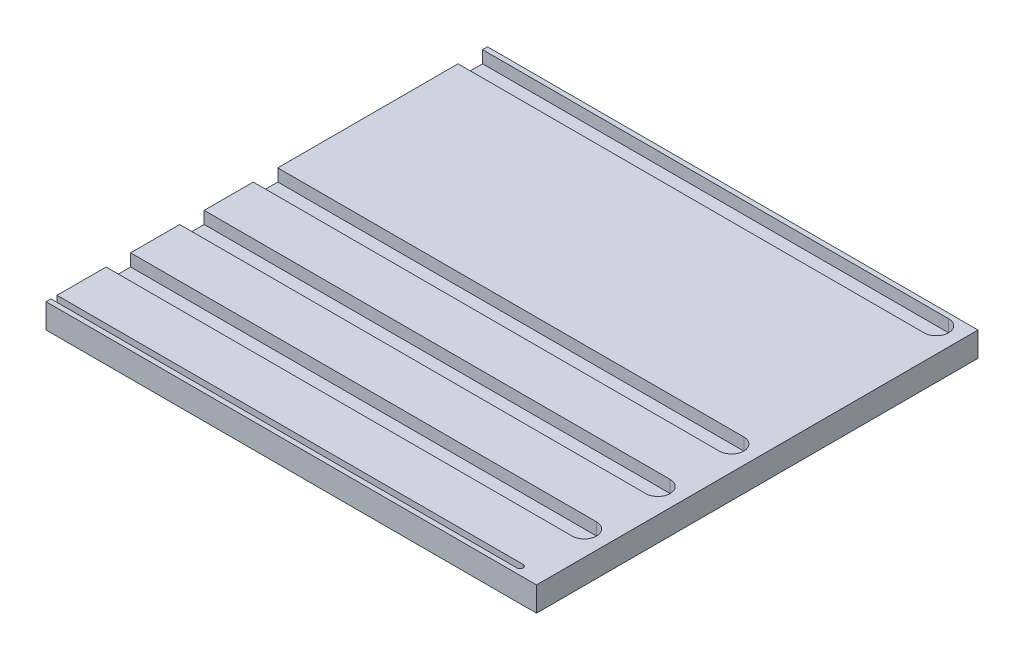
ISO-10303-21;
HEADER;
FILE_DESCRIPTION(('STEP AP214'),'2;1');
FILE_NAME('part.step','',(''),(''),'','','');
FILE_SCHEMA(('AUTOMOTIVE_DESIGN { 1 0 10303 214 1 1 1 1 }'));
ENDSEC;
DATA;
#1=APPLICATION_CONTEXT('core data for automotive mechanical design processes');
#2=APPLICATION_PROTOCOL_DEFINITION('international standard','automotive_design',2000,#1);
#3=PRODUCT_CONTEXT('',#1,'mechanical');
#4=PRODUCT('Part','Part','',(#3));
#5=PRODUCT_RELATED_PRODUCT_CATEGORY('part','',(#4));
#6=PRODUCT_DEFINITION_FORMATION('','',#4);
#7=PRODUCT_DEFINITION_CONTEXT('part definition',#1,'design');
#8=PRODUCT_DEFINITION('design','',#6,#7);
#9=PRODUCT_DEFINITION_SHAPE('','',#8);
#10=(LENGTH_UNIT() NAMED_UNIT(*) SI_UNIT(.MILLI.,.METRE.));
#11=(NAMED_UNIT(*) PLANE_ANGLE_UNIT() SI_UNIT($,.RADIAN.));
#12=(NAMED_UNIT(*) SI_UNIT($,.STERADIAN.) SOLID_ANGLE_UNIT());
#13=UNCERTAINTY_MEASURE_WITH_UNIT(LENGTH_MEASURE(1.E-05),#10,'distance_accuracy_value','');
#14=(GEOMETRIC_REPRESENTATION_CONTEXT(3) GLOBAL_UNCERTAINTY_ASSIGNED_CONTEXT((#13)) GLOBAL_UNIT_ASSIGNED_CONTEXT((#10,
#11,#12)) REPRESENTATION_CONTEXT('',''));
#15=CARTESIAN_POINT('',(0.,0.,0.));
#16=DIRECTION('',(0.,0.,1.));
#17=DIRECTION('',(1.,0.,0.));
#18=AXIS2_PLACEMENT_3D('',#15,#16,#17);
#19=CARTESIAN_POINT('',(0.,-6.35,0.));
#20=DIRECTION('',(-1.,0.,0.));
#21=DIRECTION('',(0.,0.,1.));
#22=AXIS2_PLACEMENT_3D('',#19,#20,#21);
#23=PLANE('',#22);
#24=DIRECTION('',(0.,1.,0.));
#25=VECTOR('',#24,1.);
#26=CARTESIAN_POINT('',(0.,-3.175,-53.6575));
#27=LINE('',#26,#25);
#28=CARTESIAN_POINT('',(0.,-3.175,-53.6575));
#29=VERTEX_POINT('',#28);
#30=CARTESIAN_POINT('',(0.,0.,-53.6575));
#31=VERTEX_POINT('',#30);
#32=EDGE_CURVE('E224',#29,#31,#27,.T.);
#33=ORIENTED_EDGE('',*,*,#32,.F.);
#34=DIRECTION('',(0.,0.,1.));
#35=VECTOR('',#34,1.);
#36=CARTESIAN_POINT('',(0.,-3.175,-57.15));
#37=LINE('',#36,#35);
#38=CARTESIAN_POINT('',(0.,-3.175,-60.0075));
#39=VERTEX_POINT('',#38);
#40=EDGE_CURVE('E201',#39,#29,#37,.T.);
#41=ORIENTED_EDGE('',*,*,#40,.F.);
#42=DIRECTION('',(0.,1.,0.));
#43=VECTOR('',#42,1.);
#44=CARTESIAN_POINT('',(0.,-3.175,-60.0075));
#45=LINE('',#44,#43);
#46=CARTESIAN_POINT('',(0.,0.,-60.0075));
#47=VERTEX_POINT('',#46);
#48=EDGE_CURVE('E226',#39,#47,#45,.T.);
#49=ORIENTED_EDGE('',*,*,#48,.T.);
#50=DIRECTION('',(0.,0.,1.));
#51=VECTOR('',#50,1.);
#52=CARTESIAN_POINT('',(0.,0.,0.));
#53=LINE('',#52,#51);
#54=CARTESIAN_POINT('',(0.,0.,-106.68));
#55=VERTEX_POINT('',#54);
#56=EDGE_CURVE('E362',#55,#47,#53,.T.);
#57=ORIENTED_EDGE('',*,*,#56,.F.);
#58=DIRECTION('',(0.,1.,0.));
#59=VECTOR('',#58,1.);
#60=CARTESIAN_POINT('',(0.,-3.175,-106.68));
#61=LINE('',#60,#59);
#62=CARTESIAN_POINT('',(0.,-3.175,-106.68));
#63=VERTEX_POINT('',#62);
#64=EDGE_CURVE('E335',#63,#55,#61,.T.);
#65=ORIENTED_EDGE('',*,*,#64,.F.);
#66=DIRECTION('',(0.,0.,1.));
#67=VECTOR('',#66,1.);
#68=CARTESIAN_POINT('',(0.,-3.175,-57.15));
#69=LINE('',#68,#67);
#70=CARTESIAN_POINT('',(0.,-3.175,-113.03));
#71=VERTEX_POINT('',#70);
#72=EDGE_CURVE('E325',#71,#63,#69,.T.);
#73=ORIENTED_EDGE('',*,*,#72,.F.);
#74=DIRECTION('',(0.,1.,0.));
#75=VECTOR('',#74,1.);
#76=CARTESIAN_POINT('',(0.,-3.175,-113.03));
#77=LINE('',#76,#75);
#78=CARTESIAN_POINT('',(0.,0.,-113.03));
#79=VERTEX_POINT('',#78);
#80=EDGE_CURVE('E338',#71,#79,#77,.T.);
#81=ORIENTED_EDGE('',*,*,#80,.T.);
#82=CARTESIAN_POINT('',(0.,0.,-114.3));
#83=VERTEX_POINT('',#82);
#84=EDGE_CURVE('E358',#83,#79,#53,.T.);
#85=ORIENTED_EDGE('',*,*,#84,.F.);
#86=DIRECTION('',(0.,1.,0.));
#87=VECTOR('',#86,1.);
#88=CARTESIAN_POINT('',(0.,-6.35,-114.3));
#89=LINE('',#88,#87);
#90=CARTESIAN_POINT('',(0.,-6.35,-114.3));
#91=VERTEX_POINT('',#90);
#92=EDGE_CURVE('E11',#91,#83,#89,.T.);
#93=ORIENTED_EDGE('',*,*,#92,.F.);
#94=DIRECTION('',(0.,0.,1.));
#95=VECTOR('',#94,1.);
#96=CARTESIAN_POINT('',(0.,-6.35,0.));
#97=LINE('',#96,#95);
#98=CARTESIAN_POINT('',(0.,-6.35,0.));
#99=VERTEX_POINT('',#98);
#100=EDGE_CURVE('E345',#91,#99,#97,.T.);
#101=ORIENTED_EDGE('',*,*,#100,.T.);
#102=DIRECTION('',(0.,1.,0.));
#103=VECTOR('',#102,1.);
#104=CARTESIAN_POINT('',(0.,-6.35,0.));
#105=LINE('',#104,#103);
#106=CARTESIAN_POINT('',(0.,0.,0.));
#107=VERTEX_POINT('',#106);
#108=EDGE_CURVE('E36',#99,#107,#105,.T.);
#109=ORIENTED_EDGE('',*,*,#108,.T.);
#110=CARTESIAN_POINT('',(0.,0.,-1.26999999999999));
#111=VERTEX_POINT('',#110);
#112=EDGE_CURVE('E337',#111,#107,#53,.T.);
#113=ORIENTED_EDGE('',*,*,#112,.F.);
#114=DIRECTION('',(0.,1.,0.));
#115=VECTOR('',#114,1.);
#116=CARTESIAN_POINT('',(0.,-3.175,-1.26999999999999));
#117=LINE('',#116,#115);
#118=CARTESIAN_POINT('',(0.,-3.175,-1.26999999999999));
#119=VERTEX_POINT('',#118);
#120=EDGE_CURVE('E306',#119,#111,#117,.T.);
#121=ORIENTED_EDGE('',*,*,#120,.F.);
#122=DIRECTION('',(0.,0.,1.));
#123=VECTOR('',#122,1.);
#124=CARTESIAN_POINT('',(0.,-3.175,-57.15));
#125=LINE('',#124,#123);
#126=CARTESIAN_POINT('',(0.,-3.175,-2.8575));
#127=VERTEX_POINT('',#126);
#128=EDGE_CURVE('E296',#127,#119,#125,.T.);
#129=ORIENTED_EDGE('',*,*,#128,.F.);
#130=DIRECTION('',(0.,1.,0.));
#131=VECTOR('',#130,1.);
#132=CARTESIAN_POINT('',(0.,-3.175,-2.8575));
#133=LINE('',#132,#131);
#134=CARTESIAN_POINT('',(0.,0.,-2.8575));
#135=VERTEX_POINT('',#134);
#136=EDGE_CURVE('E309',#127,#135,#133,.T.);
#137=ORIENTED_EDGE('',*,*,#136,.T.);
#138=CARTESIAN_POINT('',(0.,0.,-15.5575));
#139=VERTEX_POINT('',#138);
#140=EDGE_CURVE('E387',#139,#135,#53,.T.);
#141=ORIENTED_EDGE('',*,*,#140,.F.);
#142=DIRECTION('',(0.,1.,0.));
#143=VECTOR('',#142,1.);
#144=CARTESIAN_POINT('',(0.,-3.175,-15.5575));
#145=LINE('',#144,#143);
#146=CARTESIAN_POINT('',(0.,-3.175,-15.5575));
#147=VERTEX_POINT('',#146);
#148=EDGE_CURVE('E277',#147,#139,#145,.T.);
#149=ORIENTED_EDGE('',*,*,#148,.F.);
#150=DIRECTION('',(0.,0.,1.));
#151=VECTOR('',#150,1.);
#152=CARTESIAN_POINT('',(0.,-3.175,-57.15));
#153=LINE('',#152,#151);
#154=CARTESIAN_POINT('',(0.,-3.175,-21.9075));
#155=VERTEX_POINT('',#154);
#156=EDGE_CURVE('E267',#155,#147,#153,.T.);
#157=ORIENTED_EDGE('',*,*,#156,.F.);
#158=DIRECTION('',(0.,1.,0.));
#159=VECTOR('',#158,1.);
#160=CARTESIAN_POINT('',(0.,-3.175,-21.9075));
#161=LINE('',#160,#159);
#162=CARTESIAN_POINT('',(0.,0.,-21.9075));
#163=VERTEX_POINT('',#162);
#164=EDGE_CURVE('E280',#155,#163,#161,.T.);
#165=ORIENTED_EDGE('',*,*,#164,.T.);
#166=CARTESIAN_POINT('',(0.,0.,-34.6075));
#167=VERTEX_POINT('',#166);
#168=EDGE_CURVE('E388',#167,#163,#53,.T.);
#169=ORIENTED_EDGE('',*,*,#168,.F.);
#170=DIRECTION('',(0.,1.,0.));
#171=VECTOR('',#170,1.);
#172=CARTESIAN_POINT('',(0.,-3.175,-34.6075));
#173=LINE('',#172,#171);
#174=CARTESIAN_POINT('',(0.,-3.175,-34.6075));
#175=VERTEX_POINT('',#174);
#176=EDGE_CURVE('E249',#175,#167,#173,.T.);
#177=ORIENTED_EDGE('',*,*,#176,.F.);
#178=DIRECTION('',(0.,0.,1.));
#179=VECTOR('',#178,1.);
#180=CARTESIAN_POINT('',(0.,-3.175,-57.15));
#181=LINE('',#180,#179);
#182=CARTESIAN_POINT('',(0.,-3.175,-40.9575));
#183=VERTEX_POINT('',#182);
#184=EDGE_CURVE('E239',#183,#175,#181,.T.);
#185=ORIENTED_EDGE('',*,*,#184,.F.);
#186=DIRECTION('',(0.,1.,0.));
#187=VECTOR('',#186,1.);
#188=CARTESIAN_POINT('',(0.,-3.175,-40.9575));
#189=LINE('',#188,#187);
#190=CARTESIAN_POINT('',(0.,0.,-40.9575));
#191=VERTEX_POINT('',#190);
#192=EDGE_CURVE('E252',#183,#191,#189,.T.);
#193=ORIENTED_EDGE('',*,*,#192,.T.);
#194=EDGE_CURVE('E363',#31,#191,#53,.T.);
#195=ORIENTED_EDGE('',*,*,#194,.F.);
#196=EDGE_LOOP('',(#33,#41,#49,#57,#65,#73,#81,#85,#93,#101,#109,#113,#121,#129,#137,#141,#149,
#157,#165,#169,#177,#185,#193,#195));
#197=FACE_BOUND('',#196,.T.);
#198=ADVANCED_FACE('F33',(#197),#23,.T.);
#199=CARTESIAN_POINT('',(0.,-6.35,-114.3));
#200=DIRECTION('',(0.,0.,-1.));
#201=DIRECTION('',(-1.,0.,0.));
#202=AXIS2_PLACEMENT_3D('',#199,#200,#201);
#203=PLANE('',#202);
#204=DIRECTION('',(-1.,0.,0.));
#205=VECTOR('',#204,1.);
#206=CARTESIAN_POINT('',(0.,0.,-114.3));
#207=LINE('',#206,#205);
#208=CARTESIAN_POINT('',(127.,0.,-114.3));
#209=VERTEX_POINT('',#208);
#210=EDGE_CURVE('E349',#209,#83,#207,.T.);
#211=ORIENTED_EDGE('',*,*,#210,.F.);
#212=DIRECTION('',(0.,1.,0.));
#213=VECTOR('',#212,1.);
#214=CARTESIAN_POINT('',(127.,-6.35,-114.3));
#215=LINE('',#214,#213);
#216=CARTESIAN_POINT('',(127.,-6.35,-114.3));
#217=VERTEX_POINT('',#216);
#218=EDGE_CURVE('E41',#217,#209,#215,.T.);
#219=ORIENTED_EDGE('',*,*,#218,.F.);
#220=DIRECTION('',(-1.,0.,0.));
#221=VECTOR('',#220,1.);
#222=CARTESIAN_POINT('',(0.,-6.35,-114.3));
#223=LINE('',#222,#221);
#224=EDGE_CURVE('E355',#217,#91,#223,.T.);
#225=ORIENTED_EDGE('',*,*,#224,.T.);
#226=ORIENTED_EDGE('',*,*,#92,.T.);
#227=EDGE_LOOP('',(#211,#219,#225,#226));
#228=FACE_BOUND('',#227,.T.);
#229=ADVANCED_FACE('F439',(#228),#203,.T.);
#230=CARTESIAN_POINT('',(127.,-6.35,0.));
#231=DIRECTION('',(1.,0.,0.));
#232=DIRECTION('',(0.,0.,-1.));
#233=AXIS2_PLACEMENT_3D('',#230,#231,#232);
#234=PLANE('',#233);
#235=DIRECTION('',(0.,0.,-1.));
#236=VECTOR('',#235,1.);
#237=CARTESIAN_POINT('',(127.,0.,0.));
#238=LINE('',#237,#236);
#239=CARTESIAN_POINT('',(127.,0.,0.));
#240=VERTEX_POINT('',#239);
#241=EDGE_CURVE('E366',#240,#209,#238,.T.);
#242=ORIENTED_EDGE('',*,*,#241,.F.);
#243=DIRECTION('',(0.,1.,0.));
#244=VECTOR('',#243,1.);
#245=CARTESIAN_POINT('',(127.,-6.35,0.));
#246=LINE('',#245,#244);
#247=CARTESIAN_POINT('',(127.,-6.35,0.));
#248=VERTEX_POINT('',#247);
#249=EDGE_CURVE('E371',#248,#240,#246,.T.);
#250=ORIENTED_EDGE('',*,*,#249,.F.);
#251=DIRECTION('',(0.,0.,-1.));
#252=VECTOR('',#251,1.);
#253=CARTESIAN_POINT('',(127.,-6.35,0.));
#254=LINE('',#253,#252);
#255=EDGE_CURVE('E352',#248,#217,#254,.T.);
#256=ORIENTED_EDGE('',*,*,#255,.T.);
#257=ORIENTED_EDGE('',*,*,#218,.T.);
#258=EDGE_LOOP('',(#242,#250,#256,#257));
#259=FACE_BOUND('',#258,.T.);
#260=ADVANCED_FACE('F443',(#259),#234,.T.);
#261=CARTESIAN_POINT('',(0.,-6.35,0.));
#262=DIRECTION('',(0.,0.,1.));
#263=DIRECTION('',(1.,0.,0.));
#264=AXIS2_PLACEMENT_3D('',#261,#262,#263);
#265=PLANE('',#264);
#266=DIRECTION('',(1.,0.,0.));
#267=VECTOR('',#266,1.);
#268=CARTESIAN_POINT('',(0.,0.,0.));
#269=LINE('',#268,#267);
#270=EDGE_CURVE('E361',#107,#240,#269,.T.);
#271=ORIENTED_EDGE('',*,*,#270,.F.);
#272=ORIENTED_EDGE('',*,*,#108,.F.);
#273=DIRECTION('',(1.,0.,0.));
#274=VECTOR('',#273,1.);
#275=CARTESIAN_POINT('',(0.,-6.35,0.));
#276=LINE('',#275,#274);
#277=EDGE_CURVE('E348',#99,#248,#276,.T.);
#278=ORIENTED_EDGE('',*,*,#277,.T.);
#279=ORIENTED_EDGE('',*,*,#249,.T.);
#280=EDGE_LOOP('',(#271,#272,#278,#279));
#281=FACE_BOUND('',#280,.T.);
#282=ADVANCED_FACE('F381',(#281),#265,.T.);
#283=CARTESIAN_POINT('',(0.,-6.35,-114.3));
#284=DIRECTION('',(0.,-1.,0.));
#285=DIRECTION('',(0.,0.,-1.));
#286=AXIS2_PLACEMENT_3D('',#283,#284,#285);
#287=PLANE('',#286);
#288=ORIENTED_EDGE('',*,*,#100,.F.);
#289=ORIENTED_EDGE('',*,*,#224,.F.);
#290=ORIENTED_EDGE('',*,*,#255,.F.);
#291=ORIENTED_EDGE('',*,*,#277,.F.);
#292=EDGE_LOOP('',(#288,#289,#290,#291));
#293=FACE_BOUND('',#292,.T.);
#294=ADVANCED_FACE('F454',(#293),#287,.T.);
#295=CARTESIAN_POINT('',(0.,0.,-114.3));
#296=DIRECTION('',(0.,-1.,0.));
#297=DIRECTION('',(0.,0.,-1.));
#298=AXIS2_PLACEMENT_3D('',#295,#296,#297);
#299=PLANE('',#298);
#300=CARTESIAN_POINT('',(120.65,0.,-56.8325));
#301=DIRECTION('',(0.,1.,0.));
#302=DIRECTION('',(0.,0.,1.));
#303=AXIS2_PLACEMENT_3D('',#300,#301,#302);
#304=CIRCLE('',#303,3.175);
#305=CARTESIAN_POINT('',(120.65,0.,-53.6575));
#306=VERTEX_POINT('',#305);
#307=CARTESIAN_POINT('',(120.65,0.,-60.0075));
#308=VERTEX_POINT('',#307);
#309=EDGE_CURVE('E217',#306,#308,#304,.T.);
#310=ORIENTED_EDGE('',*,*,#309,.F.);
#311=DIRECTION('',(1.,0.,0.));
#312=VECTOR('',#311,1.);
#313=CARTESIAN_POINT('',(-69.5401100254638,0.,-53.6575));
#314=LINE('',#313,#312);
#315=EDGE_CURVE('E49',#31,#306,#314,.T.);
#316=ORIENTED_EDGE('',*,*,#315,.F.);
#317=ORIENTED_EDGE('',*,*,#194,.T.);
#318=DIRECTION('',(1.,0.,0.));
#319=VECTOR('',#318,1.);
#320=CARTESIAN_POINT('',(-69.5401100254638,0.,-40.9575));
#321=LINE('',#320,#319);
#322=CARTESIAN_POINT('',(120.65,0.,-40.9575));
#323=VERTEX_POINT('',#322);
#324=EDGE_CURVE('E234',#191,#323,#321,.T.);
#325=ORIENTED_EDGE('',*,*,#324,.T.);
#326=CARTESIAN_POINT('',(120.65,0.,-37.7825));
#327=DIRECTION('',(0.,1.,0.));
#328=DIRECTION('',(0.,0.,1.));
#329=AXIS2_PLACEMENT_3D('',#326,#327,#328);
#330=CIRCLE('',#329,3.17499999999999);
#331=CARTESIAN_POINT('',(120.65,0.,-34.6075));
#332=VERTEX_POINT('',#331);
#333=EDGE_CURVE('E244',#332,#323,#330,.T.);
#334=ORIENTED_EDGE('',*,*,#333,.F.);
#335=DIRECTION('',(1.,0.,0.));
#336=VECTOR('',#335,1.);
#337=CARTESIAN_POINT('',(-69.5401100254638,0.,-34.6075));
#338=LINE('',#337,#336);
#339=EDGE_CURVE('E57',#167,#332,#338,.T.);
#340=ORIENTED_EDGE('',*,*,#339,.F.);
#341=ORIENTED_EDGE('',*,*,#168,.T.);
#342=DIRECTION('',(1.,0.,0.));
#343=VECTOR('',#342,1.);
#344=CARTESIAN_POINT('',(-69.5401100254638,0.,-21.9075));
#345=LINE('',#344,#343);
#346=CARTESIAN_POINT('',(120.65,0.,-21.9075));
#347=VERTEX_POINT('',#346);
#348=EDGE_CURVE('E262',#163,#347,#345,.T.);
#349=ORIENTED_EDGE('',*,*,#348,.T.);
#350=CARTESIAN_POINT('',(120.65,0.,-18.7325));
#351=DIRECTION('',(0.,1.,0.));
#352=DIRECTION('',(0.,0.,1.));
#353=AXIS2_PLACEMENT_3D('',#350,#351,#352);
#354=CIRCLE('',#353,3.175);
#355=CARTESIAN_POINT('',(120.65,0.,-15.5575));
#356=VERTEX_POINT('',#355);
#357=EDGE_CURVE('E272',#356,#347,#354,.T.);
#358=ORIENTED_EDGE('',*,*,#357,.F.);
#359=DIRECTION('',(1.,0.,0.));
#360=VECTOR('',#359,1.);
#361=CARTESIAN_POINT('',(-69.5401100254638,0.,-15.5575));
#362=LINE('',#361,#360);
#363=EDGE_CURVE('E251',#139,#356,#362,.T.);
#364=ORIENTED_EDGE('',*,*,#363,.F.);
#365=ORIENTED_EDGE('',*,*,#140,.T.);
#366=DIRECTION('',(1.,0.,0.));
#367=VECTOR('',#366,1.);
#368=CARTESIAN_POINT('',(-69.5401100254638,0.,-2.8575));
#369=LINE('',#368,#367);
#370=CARTESIAN_POINT('',(120.65,0.,-2.8575));
#371=VERTEX_POINT('',#370);
#372=EDGE_CURVE('E291',#135,#371,#369,.T.);
#373=ORIENTED_EDGE('',*,*,#372,.T.);
#374=CARTESIAN_POINT('',(120.65,0.,-2.06375));
#375=DIRECTION('',(0.,1.,0.));
#376=DIRECTION('',(0.,0.,1.));
#377=AXIS2_PLACEMENT_3D('',#374,#375,#376);
#378=CIRCLE('',#377,0.79375);
#379=CARTESIAN_POINT('',(120.65,0.,-1.27));
#380=VERTEX_POINT('',#379);
#381=EDGE_CURVE('E301',#380,#371,#378,.T.);
#382=ORIENTED_EDGE('',*,*,#381,.F.);
#383=DIRECTION('',(1.,0.,0.));
#384=VECTOR('',#383,1.);
#385=CARTESIAN_POINT('',(-69.5401100254638,0.,-1.26999999999999));
#386=LINE('',#385,#384);
#387=EDGE_CURVE('E279',#111,#380,#386,.T.);
#388=ORIENTED_EDGE('',*,*,#387,.F.);
#389=ORIENTED_EDGE('',*,*,#112,.T.);
#390=ORIENTED_EDGE('',*,*,#270,.T.);
#391=ORIENTED_EDGE('',*,*,#241,.T.);
#392=ORIENTED_EDGE('',*,*,#210,.T.);
#393=ORIENTED_EDGE('',*,*,#84,.T.);
#394=DIRECTION('',(1.,0.,0.));
#395=VECTOR('',#394,1.);
#396=CARTESIAN_POINT('',(-69.5401100254638,0.,-113.03));
#397=LINE('',#396,#395);
#398=CARTESIAN_POINT('',(120.65,0.,-113.03));
#399=VERTEX_POINT('',#398);
#400=EDGE_CURVE('E320',#79,#399,#397,.T.);
#401=ORIENTED_EDGE('',*,*,#400,.T.);
#402=CARTESIAN_POINT('',(120.65,0.,-109.855));
#403=DIRECTION('',(0.,1.,0.));
#404=DIRECTION('',(0.,0.,1.));
#405=AXIS2_PLACEMENT_3D('',#402,#403,#404);
#406=CIRCLE('',#405,3.175);
#407=CARTESIAN_POINT('',(120.65,0.,-106.68));
#408=VERTEX_POINT('',#407);
#409=EDGE_CURVE('E330',#408,#399,#406,.T.);
#410=ORIENTED_EDGE('',*,*,#409,.F.);
#411=DIRECTION('',(1.,0.,0.));
#412=VECTOR('',#411,1.);
#413=CARTESIAN_POINT('',(-69.5401100254638,0.,-106.68));
#414=LINE('',#413,#412);
#415=EDGE_CURVE('E308',#55,#408,#414,.T.);
#416=ORIENTED_EDGE('',*,*,#415,.F.);
#417=ORIENTED_EDGE('',*,*,#56,.T.);
#418=DIRECTION('',(1.,0.,0.));
#419=VECTOR('',#418,1.);
#420=CARTESIAN_POINT('',(-69.5401100254638,0.,-60.0075));
#421=LINE('',#420,#419);
#422=EDGE_CURVE('E214',#47,#308,#421,.T.);
#423=ORIENTED_EDGE('',*,*,#422,.T.);
#424=EDGE_LOOP('',(#310,#316,#317,#325,#334,#340,#341,#349,#358,#364,#365,#373,#382,#388,#389,
#390,#391,#392,#393,#401,#410,#416,#417,#423));
#425=FACE_BOUND('',#424,.T.);
#426=ADVANCED_FACE('F383',(#425),#299,.F.);
#427=CARTESIAN_POINT('',(-69.5401100254638,-3.175,-106.68));
#428=DIRECTION('',(0.,0.,1.));
#429=DIRECTION('',(1.,0.,0.));
#430=AXIS2_PLACEMENT_3D('',#427,#428,#429);
#431=PLANE('',#430);
#432=ORIENTED_EDGE('',*,*,#415,.T.);
#433=DIRECTION('',(0.,1.,0.));
#434=VECTOR('',#433,1.);
#435=CARTESIAN_POINT('',(120.65,-3.175,-106.68));
#436=LINE('',#435,#434);
#437=CARTESIAN_POINT('',(120.65,-3.175,-106.68));
#438=VERTEX_POINT('',#437);
#439=EDGE_CURVE('E328',#438,#408,#436,.T.);
#440=ORIENTED_EDGE('',*,*,#439,.F.);
#441=DIRECTION('',(1.,0.,0.));
#442=VECTOR('',#441,1.);
#443=CARTESIAN_POINT('',(-69.5401100254638,-3.175,-106.68));
#444=LINE('',#443,#442);
#445=EDGE_CURVE('E316',#63,#438,#444,.T.);
#446=ORIENTED_EDGE('',*,*,#445,.F.);
#447=ORIENTED_EDGE('',*,*,#64,.T.);
#448=EDGE_LOOP('',(#432,#440,#446,#447));
#449=FACE_BOUND('',#448,.T.);
#450=ADVANCED_FACE('F462',(#449),#431,.F.);
#451=CARTESIAN_POINT('',(-69.5401100254638,-3.175,-113.03));
#452=DIRECTION('',(0.,0.,1.));
#453=DIRECTION('',(1.,0.,0.));
#454=AXIS2_PLACEMENT_3D('',#451,#452,#453);
#455=PLANE('',#454);
#456=ORIENTED_EDGE('',*,*,#400,.F.);
#457=ORIENTED_EDGE('',*,*,#80,.F.);
#458=DIRECTION('',(1.,0.,0.));
#459=VECTOR('',#458,1.);
#460=CARTESIAN_POINT('',(-69.5401100254638,-3.175,-113.03));
#461=LINE('',#460,#459);
#462=CARTESIAN_POINT('',(120.65,-3.175,-113.03));
#463=VERTEX_POINT('',#462);
#464=EDGE_CURVE('E323',#71,#463,#461,.T.);
#465=ORIENTED_EDGE('',*,*,#464,.T.);
#466=DIRECTION('',(0.,1.,0.));
#467=VECTOR('',#466,1.);
#468=CARTESIAN_POINT('',(120.65,-3.175,-113.03));
#469=LINE('',#468,#467);
#470=EDGE_CURVE('E341',#463,#399,#469,.T.);
#471=ORIENTED_EDGE('',*,*,#470,.T.);
#472=EDGE_LOOP('',(#456,#457,#465,#471));
#473=FACE_BOUND('',#472,.T.);
#474=ADVANCED_FACE('F466',(#473),#455,.T.);
#475=CARTESIAN_POINT('',(120.65,-3.175,-109.855));
#476=DIRECTION('',(0.,1.,0.));
#477=DIRECTION('',(0.,0.,1.));
#478=AXIS2_PLACEMENT_3D('',#475,#476,#477);
#479=CYLINDRICAL_SURFACE('',#478,3.175);
#480=ORIENTED_EDGE('',*,*,#409,.T.);
#481=ORIENTED_EDGE('',*,*,#470,.F.);
#482=CARTESIAN_POINT('',(120.65,-3.175,-109.855));
#483=DIRECTION('',(0.,1.,0.));
#484=DIRECTION('',(0.,0.,1.));
#485=AXIS2_PLACEMENT_3D('',#482,#483,#484);
#486=CIRCLE('',#485,3.175);
#487=EDGE_CURVE('E319',#438,#463,#486,.T.);
#488=ORIENTED_EDGE('',*,*,#487,.F.);
#489=ORIENTED_EDGE('',*,*,#439,.T.);
#490=EDGE_LOOP('',(#480,#481,#488,#489));
#491=FACE_BOUND('',#490,.T.);
#492=ADVANCED_FACE('F434',(#491),#479,.F.);
#493=CARTESIAN_POINT('',(-69.5401100254638,-3.175,-57.15));
#494=DIRECTION('',(0.,1.,0.));
#495=DIRECTION('',(0.,0.,1.));
#496=AXIS2_PLACEMENT_3D('',#493,#494,#495);
#497=PLANE('',#496);
#498=ORIENTED_EDGE('',*,*,#445,.T.);
#499=ORIENTED_EDGE('',*,*,#487,.T.);
#500=ORIENTED_EDGE('',*,*,#464,.F.);
#501=ORIENTED_EDGE('',*,*,#72,.T.);
#502=EDGE_LOOP('',(#498,#499,#500,#501));
#503=FACE_BOUND('',#502,.T.);
#504=ADVANCED_FACE('F427',(#503),#497,.T.);
#505=CARTESIAN_POINT('',(-69.5401100254638,-3.175,-1.26999999999999));
#506=DIRECTION('',(0.,0.,1.));
#507=DIRECTION('',(1.,0.,0.));
#508=AXIS2_PLACEMENT_3D('',#505,#506,#507);
#509=PLANE('',#508);
#510=ORIENTED_EDGE('',*,*,#387,.T.);
#511=DIRECTION('',(0.,1.,0.));
#512=VECTOR('',#511,1.);
#513=CARTESIAN_POINT('',(120.65,-3.175,-1.27));
#514=LINE('',#513,#512);
#515=CARTESIAN_POINT('',(120.65,-3.175,-1.27));
#516=VERTEX_POINT('',#515);
#517=EDGE_CURVE('E299',#516,#380,#514,.T.);
#518=ORIENTED_EDGE('',*,*,#517,.F.);
#519=DIRECTION('',(1.,0.,0.));
#520=VECTOR('',#519,1.);
#521=CARTESIAN_POINT('',(-69.5401100254638,-3.175,-1.26999999999999));
#522=LINE('',#521,#520);
#523=EDGE_CURVE('E287',#119,#516,#522,.T.);
#524=ORIENTED_EDGE('',*,*,#523,.F.);
#525=ORIENTED_EDGE('',*,*,#120,.T.);
#526=EDGE_LOOP('',(#510,#518,#524,#525));
#527=FACE_BOUND('',#526,.T.);
#528=ADVANCED_FACE('F425',(#527),#509,.F.);
#529=CARTESIAN_POINT('',(-69.5401100254638,-3.175,-2.8575));
#530=DIRECTION('',(0.,0.,1.));
#531=DIRECTION('',(1.,0.,0.));
#532=AXIS2_PLACEMENT_3D('',#529,#530,#531);
#533=PLANE('',#532);
#534=ORIENTED_EDGE('',*,*,#372,.F.);
#535=ORIENTED_EDGE('',*,*,#136,.F.);
#536=DIRECTION('',(1.,0.,0.));
#537=VECTOR('',#536,1.);
#538=CARTESIAN_POINT('',(-69.5401100254638,-3.175,-2.8575));
#539=LINE('',#538,#537);
#540=CARTESIAN_POINT('',(120.65,-3.175,-2.8575));
#541=VERTEX_POINT('',#540);
#542=EDGE_CURVE('E294',#127,#541,#539,.T.);
#543=ORIENTED_EDGE('',*,*,#542,.T.);
#544=DIRECTION('',(0.,1.,0.));
#545=VECTOR('',#544,1.);
#546=CARTESIAN_POINT('',(120.65,-3.175,-2.8575));
#547=LINE('',#546,#545);
#548=EDGE_CURVE('E312',#541,#371,#547,.T.);
#549=ORIENTED_EDGE('',*,*,#548,.T.);
#550=EDGE_LOOP('',(#534,#535,#543,#549));
#551=FACE_BOUND('',#550,.T.);
#552=ADVANCED_FACE('F417',(#551),#533,.T.);
#553=CARTESIAN_POINT('',(120.65,-3.175,-2.06375));
#554=DIRECTION('',(0.,1.,0.));
#555=DIRECTION('',(0.,0.,1.));
#556=AXIS2_PLACEMENT_3D('',#553,#554,#555);
#557=CYLINDRICAL_SURFACE('',#556,0.79375);
#558=ORIENTED_EDGE('',*,*,#381,.T.);
#559=ORIENTED_EDGE('',*,*,#548,.F.);
#560=CARTESIAN_POINT('',(120.65,-3.175,-2.06375));
#561=DIRECTION('',(0.,1.,0.));
#562=DIRECTION('',(0.,0.,1.));
#563=AXIS2_PLACEMENT_3D('',#560,#561,#562);
#564=CIRCLE('',#563,0.79375);
#565=EDGE_CURVE('E290',#516,#541,#564,.T.);
#566=ORIENTED_EDGE('',*,*,#565,.F.);
#567=ORIENTED_EDGE('',*,*,#517,.T.);
#568=EDGE_LOOP('',(#558,#559,#566,#567));
#569=FACE_BOUND('',#568,.T.);
#570=ADVANCED_FACE('F423',(#569),#557,.F.);
#571=CARTESIAN_POINT('',(-69.5401100254638,-3.175,-57.15));
#572=DIRECTION('',(0.,1.,0.));
#573=DIRECTION('',(0.,0.,1.));
#574=AXIS2_PLACEMENT_3D('',#571,#572,#573);
#575=PLANE('',#574);
#576=ORIENTED_EDGE('',*,*,#523,.T.);
#577=ORIENTED_EDGE('',*,*,#565,.T.);
#578=ORIENTED_EDGE('',*,*,#542,.F.);
#579=ORIENTED_EDGE('',*,*,#128,.T.);
#580=EDGE_LOOP('',(#576,#577,#578,#579));
#581=FACE_BOUND('',#580,.T.);
#582=ADVANCED_FACE('F420',(#581),#575,.T.);
#583=CARTESIAN_POINT('',(-69.5401100254638,-3.175,-15.5575));
#584=DIRECTION('',(0.,0.,1.));
#585=DIRECTION('',(1.,0.,0.));
#586=AXIS2_PLACEMENT_3D('',#583,#584,#585);
#587=PLANE('',#586);
#588=ORIENTED_EDGE('',*,*,#363,.T.);
#589=DIRECTION('',(0.,1.,0.));
#590=VECTOR('',#589,1.);
#591=CARTESIAN_POINT('',(120.65,-3.175,-15.5575));
#592=LINE('',#591,#590);
#593=CARTESIAN_POINT('',(120.65,-3.175,-15.5575));
#594=VERTEX_POINT('',#593);
#595=EDGE_CURVE('E270',#594,#356,#592,.T.);
#596=ORIENTED_EDGE('',*,*,#595,.F.);
#597=DIRECTION('',(1.,0.,0.));
#598=VECTOR('',#597,1.);
#599=CARTESIAN_POINT('',(-69.5401100254638,-3.175,-15.5575));
#600=LINE('',#599,#598);
#601=EDGE_CURVE('E258',#147,#594,#600,.T.);
#602=ORIENTED_EDGE('',*,*,#601,.F.);
#603=ORIENTED_EDGE('',*,*,#148,.T.);
#604=EDGE_LOOP('',(#588,#596,#602,#603));
#605=FACE_BOUND('',#604,.T.);
#606=ADVANCED_FACE('F509',(#605),#587,.F.);
#607=CARTESIAN_POINT('',(-69.5401100254638,-3.175,-21.9075));
#608=DIRECTION('',(0.,0.,1.));
#609=DIRECTION('',(1.,0.,0.));
#610=AXIS2_PLACEMENT_3D('',#607,#608,#609);
#611=PLANE('',#610);
#612=ORIENTED_EDGE('',*,*,#348,.F.);
#613=ORIENTED_EDGE('',*,*,#164,.F.);
#614=DIRECTION('',(1.,0.,0.));
#615=VECTOR('',#614,1.);
#616=CARTESIAN_POINT('',(-69.5401100254638,-3.175,-21.9075));
#617=LINE('',#616,#615);
#618=CARTESIAN_POINT('',(120.65,-3.175,-21.9075));
#619=VERTEX_POINT('',#618);
#620=EDGE_CURVE('E265',#155,#619,#617,.T.);
#621=ORIENTED_EDGE('',*,*,#620,.T.);
#622=DIRECTION('',(0.,1.,0.));
#623=VECTOR('',#622,1.);
#624=CARTESIAN_POINT('',(120.65,-3.175,-21.9075));
#625=LINE('',#624,#623);
#626=EDGE_CURVE('E283',#619,#347,#625,.T.);
#627=ORIENTED_EDGE('',*,*,#626,.T.);
#628=EDGE_LOOP('',(#612,#613,#621,#627));
#629=FACE_BOUND('',#628,.T.);
#630=ADVANCED_FACE('F400',(#629),#611,.T.);
#631=CARTESIAN_POINT('',(120.65,-3.175,-18.7325));
#632=DIRECTION('',(0.,1.,0.));
#633=DIRECTION('',(0.,0.,1.));
#634=AXIS2_PLACEMENT_3D('',#631,#632,#633);
#635=CYLINDRICAL_SURFACE('',#634,3.175);
#636=ORIENTED_EDGE('',*,*,#357,.T.);
#637=ORIENTED_EDGE('',*,*,#626,.F.);
#638=CARTESIAN_POINT('',(120.65,-3.175,-18.7325));
#639=DIRECTION('',(0.,1.,0.));
#640=DIRECTION('',(0.,0.,1.));
#641=AXIS2_PLACEMENT_3D('',#638,#639,#640);
#642=CIRCLE('',#641,3.175);
#643=EDGE_CURVE('E261',#594,#619,#642,.T.);
#644=ORIENTED_EDGE('',*,*,#643,.F.);
#645=ORIENTED_EDGE('',*,*,#595,.T.);
#646=EDGE_LOOP('',(#636,#637,#644,#645));
#647=FACE_BOUND('',#646,.T.);
#648=ADVANCED_FACE('F410',(#647),#635,.F.);
#649=CARTESIAN_POINT('',(-69.5401100254638,-3.175,-57.15));
#650=DIRECTION('',(0.,1.,0.));
#651=DIRECTION('',(0.,0.,1.));
#652=AXIS2_PLACEMENT_3D('',#649,#650,#651);
#653=PLANE('',#652);
#654=ORIENTED_EDGE('',*,*,#601,.T.);
#655=ORIENTED_EDGE('',*,*,#643,.T.);
#656=ORIENTED_EDGE('',*,*,#620,.F.);
#657=ORIENTED_EDGE('',*,*,#156,.T.);
#658=EDGE_LOOP('',(#654,#655,#656,#657));
#659=FACE_BOUND('',#658,.T.);
#660=ADVANCED_FACE('F407',(#659),#653,.T.);
#661=CARTESIAN_POINT('',(-69.5401100254638,-3.175,-34.6075));
#662=DIRECTION('',(0.,0.,1.));
#663=DIRECTION('',(1.,0.,0.));
#664=AXIS2_PLACEMENT_3D('',#661,#662,#663);
#665=PLANE('',#664);
#666=ORIENTED_EDGE('',*,*,#339,.T.);
#667=DIRECTION('',(0.,1.,0.));
#668=VECTOR('',#667,1.);
#669=CARTESIAN_POINT('',(120.65,-3.175,-34.6075));
#670=LINE('',#669,#668);
#671=CARTESIAN_POINT('',(120.65,-3.175,-34.6075));
#672=VERTEX_POINT('',#671);
#673=EDGE_CURVE('E242',#672,#332,#670,.T.);
#674=ORIENTED_EDGE('',*,*,#673,.F.);
#675=DIRECTION('',(1.,0.,0.));
#676=VECTOR('',#675,1.);
#677=CARTESIAN_POINT('',(-69.5401100254638,-3.175,-34.6075));
#678=LINE('',#677,#676);
#679=EDGE_CURVE('E230',#175,#672,#678,.T.);
#680=ORIENTED_EDGE('',*,*,#679,.F.);
#681=ORIENTED_EDGE('',*,*,#176,.T.);
#682=EDGE_LOOP('',(#666,#674,#680,#681));
#683=FACE_BOUND('',#682,.T.);
#684=ADVANCED_FACE('F496',(#683),#665,.F.);
#685=CARTESIAN_POINT('',(-69.5401100254638,-3.175,-40.9575));
#686=DIRECTION('',(0.,0.,1.));
#687=DIRECTION('',(1.,0.,0.));
#688=AXIS2_PLACEMENT_3D('',#685,#686,#687);
#689=PLANE('',#688);
#690=ORIENTED_EDGE('',*,*,#324,.F.);
#691=ORIENTED_EDGE('',*,*,#192,.F.);
#692=DIRECTION('',(1.,0.,0.));
#693=VECTOR('',#692,1.);
#694=CARTESIAN_POINT('',(-69.5401100254638,-3.175,-40.9575));
#695=LINE('',#694,#693);
#696=CARTESIAN_POINT('',(120.65,-3.175,-40.9575));
#697=VERTEX_POINT('',#696);
#698=EDGE_CURVE('E237',#183,#697,#695,.T.);
#699=ORIENTED_EDGE('',*,*,#698,.T.);
#700=DIRECTION('',(0.,1.,0.));
#701=VECTOR('',#700,1.);
#702=CARTESIAN_POINT('',(120.65,-3.175,-40.9575));
#703=LINE('',#702,#701);
#704=EDGE_CURVE('E255',#697,#323,#703,.T.);
#705=ORIENTED_EDGE('',*,*,#704,.T.);
#706=EDGE_LOOP('',(#690,#691,#699,#705));
#707=FACE_BOUND('',#706,.T.);
#708=ADVANCED_FACE('F489',(#707),#689,.T.);
#709=CARTESIAN_POINT('',(120.65,-3.175,-37.7825));
#710=DIRECTION('',(0.,1.,0.));
#711=DIRECTION('',(0.,0.,1.));
#712=AXIS2_PLACEMENT_3D('',#709,#710,#711);
#713=CYLINDRICAL_SURFACE('',#712,3.17499999999999);
#714=ORIENTED_EDGE('',*,*,#333,.T.);
#715=ORIENTED_EDGE('',*,*,#704,.F.);
#716=CARTESIAN_POINT('',(120.65,-3.175,-37.7825));
#717=DIRECTION('',(0.,1.,0.));
#718=DIRECTION('',(0.,0.,1.));
#719=AXIS2_PLACEMENT_3D('',#716,#717,#718);
#720=CIRCLE('',#719,3.17499999999999);
#721=EDGE_CURVE('E233',#672,#697,#720,.T.);
#722=ORIENTED_EDGE('',*,*,#721,.F.);
#723=ORIENTED_EDGE('',*,*,#673,.T.);
#724=EDGE_LOOP('',(#714,#715,#722,#723));
#725=FACE_BOUND('',#724,.T.);
#726=ADVANCED_FACE('F495',(#725),#713,.F.);
#727=CARTESIAN_POINT('',(-69.5401100254638,-3.175,-57.15));
#728=DIRECTION('',(0.,1.,0.));
#729=DIRECTION('',(0.,0.,1.));
#730=AXIS2_PLACEMENT_3D('',#727,#728,#729);
#731=PLANE('',#730);
#732=ORIENTED_EDGE('',*,*,#679,.T.);
#733=ORIENTED_EDGE('',*,*,#721,.T.);
#734=ORIENTED_EDGE('',*,*,#698,.F.);
#735=ORIENTED_EDGE('',*,*,#184,.T.);
#736=EDGE_LOOP('',(#732,#733,#734,#735));
#737=FACE_BOUND('',#736,.T.);
#738=ADVANCED_FACE('F492',(#737),#731,.T.);
#739=CARTESIAN_POINT('',(-69.5401100254638,-3.175,-53.6575));
#740=DIRECTION('',(0.,0.,1.));
#741=DIRECTION('',(1.,0.,0.));
#742=AXIS2_PLACEMENT_3D('',#739,#740,#741);
#743=PLANE('',#742);
#744=ORIENTED_EDGE('',*,*,#315,.T.);
#745=DIRECTION('',(0.,1.,0.));
#746=VECTOR('',#745,1.);
#747=CARTESIAN_POINT('',(120.65,-3.175,-53.6575));
#748=LINE('',#747,#746);
#749=CARTESIAN_POINT('',(120.65,-3.175,-53.6575));
#750=VERTEX_POINT('',#749);
#751=EDGE_CURVE('E191',#750,#306,#748,.T.);
#752=ORIENTED_EDGE('',*,*,#751,.F.);
#753=DIRECTION('',(1.,0.,0.));
#754=VECTOR('',#753,1.);
#755=CARTESIAN_POINT('',(-69.5401100254638,-3.175,-53.6575));
#756=LINE('',#755,#754);
#757=EDGE_CURVE('E195',#29,#750,#756,.T.);
#758=ORIENTED_EDGE('',*,*,#757,.F.);
#759=ORIENTED_EDGE('',*,*,#32,.T.);
#760=EDGE_LOOP('',(#744,#752,#758,#759));
#761=FACE_BOUND('',#760,.T.);
#762=ADVANCED_FACE('F193',(#761),#743,.F.);
#763=CARTESIAN_POINT('',(-69.5401100254638,-3.175,-60.0075));
#764=DIRECTION('',(0.,0.,1.));
#765=DIRECTION('',(1.,0.,0.));
#766=AXIS2_PLACEMENT_3D('',#763,#764,#765);
#767=PLANE('',#766);
#768=ORIENTED_EDGE('',*,*,#422,.F.);
#769=ORIENTED_EDGE('',*,*,#48,.F.);
#770=DIRECTION('',(1.,0.,0.));
#771=VECTOR('',#770,1.);
#772=CARTESIAN_POINT('',(-69.5401100254638,-3.175,-60.0075));
#773=LINE('',#772,#771);
#774=CARTESIAN_POINT('',(120.65,-3.175,-60.0075));
#775=VERTEX_POINT('',#774);
#776=EDGE_CURVE('E209',#39,#775,#773,.T.);
#777=ORIENTED_EDGE('',*,*,#776,.T.);
#778=DIRECTION('',(0.,1.,0.));
#779=VECTOR('',#778,1.);
#780=CARTESIAN_POINT('',(120.65,-3.175,-60.0075));
#781=LINE('',#780,#779);
#782=EDGE_CURVE('E200',#775,#308,#781,.T.);
#783=ORIENTED_EDGE('',*,*,#782,.T.);
#784=EDGE_LOOP('',(#768,#769,#777,#783));
#785=FACE_BOUND('',#784,.T.);
#786=ADVANCED_FACE('F485',(#785),#767,.T.);
#787=CARTESIAN_POINT('',(120.65,-3.175,-56.8325));
#788=DIRECTION('',(0.,1.,0.));
#789=DIRECTION('',(0.,0.,1.));
#790=AXIS2_PLACEMENT_3D('',#787,#788,#789);
#791=CYLINDRICAL_SURFACE('',#790,3.175);
#792=ORIENTED_EDGE('',*,*,#309,.T.);
#793=ORIENTED_EDGE('',*,*,#782,.F.);
#794=CARTESIAN_POINT('',(120.65,-3.175,-56.8325));
#795=DIRECTION('',(0.,1.,0.));
#796=DIRECTION('',(0.,0.,1.));
#797=AXIS2_PLACEMENT_3D('',#794,#795,#796);
#798=CIRCLE('',#797,3.175);
#799=EDGE_CURVE('E205',#750,#775,#798,.T.);
#800=ORIENTED_EDGE('',*,*,#799,.F.);
#801=ORIENTED_EDGE('',*,*,#751,.T.);
#802=EDGE_LOOP('',(#792,#793,#800,#801));
#803=FACE_BOUND('',#802,.T.);
#804=ADVANCED_FACE('F206',(#803),#791,.F.);
#805=CARTESIAN_POINT('',(-69.5401100254638,-3.175,-57.15));
#806=DIRECTION('',(0.,1.,0.));
#807=DIRECTION('',(0.,0.,1.));
#808=AXIS2_PLACEMENT_3D('',#805,#806,#807);
#809=PLANE('',#808);
#810=ORIENTED_EDGE('',*,*,#757,.T.);
#811=ORIENTED_EDGE('',*,*,#799,.T.);
#812=ORIENTED_EDGE('',*,*,#776,.F.);
#813=ORIENTED_EDGE('',*,*,#40,.T.);
#814=EDGE_LOOP('',(#810,#811,#812,#813));
#815=FACE_BOUND('',#814,.T.);
#816=ADVANCED_FACE('F211',(#815),#809,.T.);
#817=CLOSED_SHELL('',(#198,#229,#260,#282,#294,#426,#450,#474,#492,#504,#528,#552,#570,#582,
#606,#630,#648,#660,#684,#708,#726,#738,#762,#786,#804,#816));
#818=MANIFOLD_SOLID_BREP('B2',#817);
#819=ADVANCED_BREP_SHAPE_REPRESENTATION('',(#18,#818),#14);
#820=SHAPE_DEFINITION_REPRESENTATION(#9,#819);
ENDSEC;
END-ISO-10303-21;
